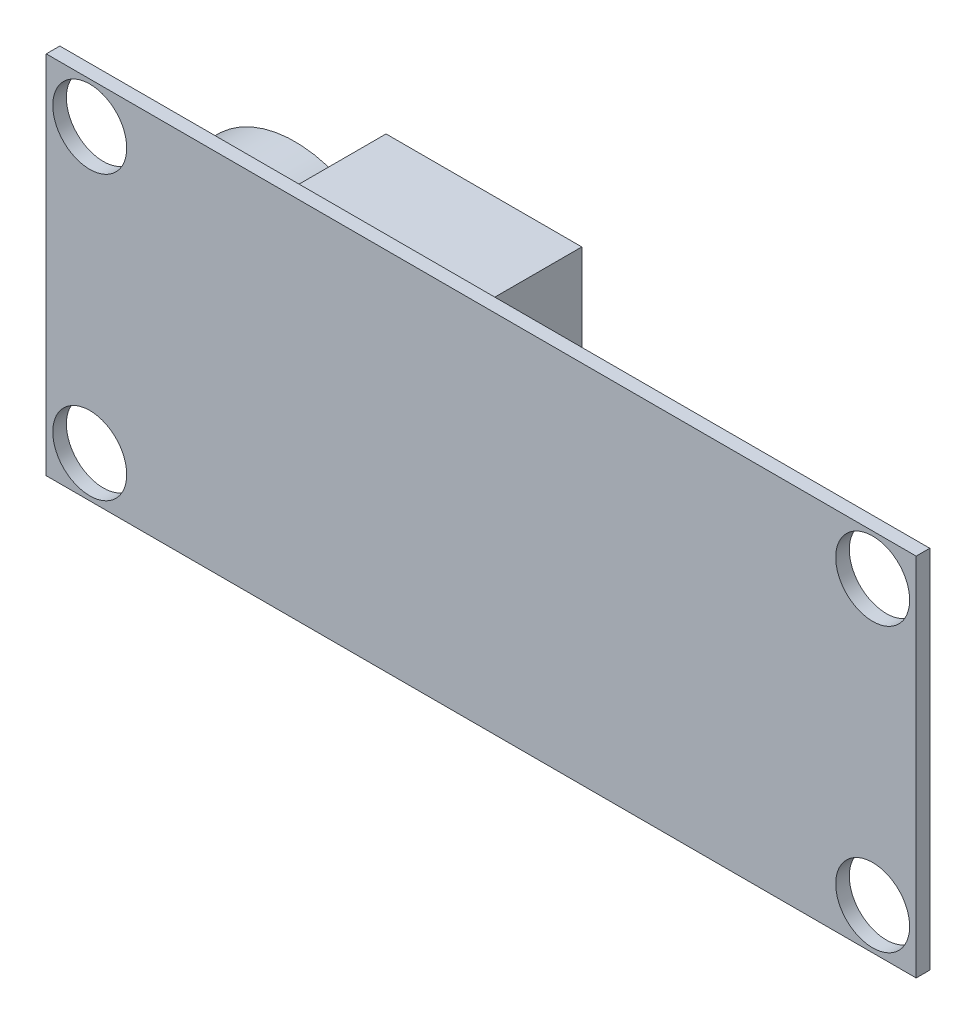
ISO-10303-21;
HEADER;
FILE_DESCRIPTION(('STEP AP214'),'2;1');
FILE_NAME('part.step','',(''),(''),'','','');
FILE_SCHEMA(('AUTOMOTIVE_DESIGN { 1 0 10303 214 1 1 1 1 }'));
ENDSEC;
DATA;
#1=APPLICATION_CONTEXT('core data for automotive mechanical design processes');
#2=APPLICATION_PROTOCOL_DEFINITION('international standard','automotive_design',2000,#1);
#3=PRODUCT_CONTEXT('',#1,'mechanical');
#4=PRODUCT('Part','Part','',(#3));
#5=PRODUCT_RELATED_PRODUCT_CATEGORY('part','',(#4));
#6=PRODUCT_DEFINITION_FORMATION('','',#4);
#7=PRODUCT_DEFINITION_CONTEXT('part definition',#1,'design');
#8=PRODUCT_DEFINITION('design','',#6,#7);
#9=PRODUCT_DEFINITION_SHAPE('','',#8);
#10=(LENGTH_UNIT() NAMED_UNIT(*) SI_UNIT(.MILLI.,.METRE.));
#11=(NAMED_UNIT(*) PLANE_ANGLE_UNIT() SI_UNIT($,.RADIAN.));
#12=(NAMED_UNIT(*) SI_UNIT($,.STERADIAN.) SOLID_ANGLE_UNIT());
#13=UNCERTAINTY_MEASURE_WITH_UNIT(LENGTH_MEASURE(1.E-05),#10,'distance_accuracy_value','');
#14=(GEOMETRIC_REPRESENTATION_CONTEXT(3) GLOBAL_UNCERTAINTY_ASSIGNED_CONTEXT((#13)) GLOBAL_UNIT_ASSIGNED_CONTEXT((#10,
#11,#12)) REPRESENTATION_CONTEXT('',''));
#15=CARTESIAN_POINT('',(0.,0.,0.));
#16=DIRECTION('',(0.,0.,1.));
#17=DIRECTION('',(1.,0.,0.));
#18=AXIS2_PLACEMENT_3D('',#15,#16,#17);
#19=CARTESIAN_POINT('',(13.97,10.668,-3.22710674583158));
#20=DIRECTION('',(1.,0.,0.));
#21=DIRECTION('',(0.,0.,-1.));
#22=AXIS2_PLACEMENT_3D('',#19,#20,#21);
#23=CYLINDRICAL_SURFACE('',#22,3.048);
#24=CARTESIAN_POINT('',(13.97,10.668,-3.22710674583158));
#25=DIRECTION('',(1.,0.,0.));
#26=DIRECTION('',(0.,0.,-1.));
#27=AXIS2_PLACEMENT_3D('',#24,#25,#26);
#28=CIRCLE('',#27,3.048);
#29=CARTESIAN_POINT('',(13.97,10.668,-6.27510674583158));
#30=VERTEX_POINT('',#29);
#31=EDGE_CURVE('E11',#30,#30,#28,.T.);
#32=ORIENTED_EDGE('',*,*,#31,.T.);
#33=EDGE_LOOP('',(#32));
#34=FACE_BOUND('',#33,.T.);
#35=CARTESIAN_POINT('',(24.13,10.668,-3.22710674583158));
#36=DIRECTION('',(1.,0.,0.));
#37=DIRECTION('',(0.,0.,-1.));
#38=AXIS2_PLACEMENT_3D('',#35,#36,#37);
#39=CIRCLE('',#38,3.048);
#40=CARTESIAN_POINT('',(24.13,10.668,-6.27510674583158));
#41=VERTEX_POINT('',#40);
#42=EDGE_CURVE('E48',#41,#41,#39,.T.);
#43=ORIENTED_EDGE('',*,*,#42,.F.);
#44=EDGE_LOOP('',(#43));
#45=FACE_BOUND('',#44,.T.);
#46=ADVANCED_FACE('F45',(#34,#45),#23,.T.);
#47=CARTESIAN_POINT('',(13.97,10.668,-3.22710674583158));
#48=DIRECTION('',(1.,0.,0.));
#49=DIRECTION('',(0.,0.,-1.));
#50=AXIS2_PLACEMENT_3D('',#47,#48,#49);
#51=PLANE('',#50);
#52=ORIENTED_EDGE('',*,*,#31,.F.);
#53=EDGE_LOOP('',(#52));
#54=FACE_BOUND('',#53,.T.);
#55=ADVANCED_FACE('F60',(#54),#51,.F.);
#56=CARTESIAN_POINT('',(24.13,10.668,-3.22710674583158));
#57=DIRECTION('',(1.,0.,0.));
#58=DIRECTION('',(0.,0.,-1.));
#59=AXIS2_PLACEMENT_3D('',#56,#57,#58);
#60=PLANE('',#59);
#61=ORIENTED_EDGE('',*,*,#42,.T.);
#62=EDGE_LOOP('',(#61));
#63=FACE_BOUND('',#62,.T.);
#64=ADVANCED_FACE('F57',(#63),#60,.T.);
#65=CLOSED_SHELL('',(#46,#55,#64));
#66=MANIFOLD_SOLID_BREP('B2',#65);
#67=CARTESIAN_POINT('',(0.,0.,0.));
#68=DIRECTION('',(0.,0.,-1.));
#69=DIRECTION('',(-1.,0.,0.));
#70=AXIS2_PLACEMENT_3D('',#67,#68,#69);
#71=PLANE('',#70);
#72=CARTESIAN_POINT('',(7.37712000203805,10.668,0.));
#73=DIRECTION('',(0.,0.,-1.));
#74=DIRECTION('',(-1.,0.,0.));
#75=AXIS2_PLACEMENT_3D('',#72,#73,#74);
#76=CIRCLE('',#75,6.35);
#77=CARTESIAN_POINT('',(1.02712000203805,10.668,0.));
#78=VERTEX_POINT('',#77);
#79=EDGE_CURVE('E428',#78,#78,#76,.T.);
#80=ORIENTED_EDGE('',*,*,#79,.F.);
#81=EDGE_LOOP('',(#80));
#82=FACE_BOUND('',#81,.T.);
#83=CARTESIAN_POINT('',(48.26,18.923,0.));
#84=DIRECTION('',(0.,0.,1.));
#85=DIRECTION('',(1.,0.,0.));
#86=AXIS2_PLACEMENT_3D('',#83,#84,#85);
#87=CIRCLE('',#86,2.159);
#88=CARTESIAN_POINT('',(50.419,18.923,0.));
#89=VERTEX_POINT('',#88);
#90=EDGE_CURVE('E252',#89,#89,#87,.T.);
#91=ORIENTED_EDGE('',*,*,#90,.T.);
#92=EDGE_LOOP('',(#91));
#93=FACE_BOUND('',#92,.T.);
#94=CARTESIAN_POINT('',(48.26,2.413,0.));
#95=DIRECTION('',(0.,0.,1.));
#96=DIRECTION('',(1.,0.,0.));
#97=AXIS2_PLACEMENT_3D('',#94,#95,#96);
#98=CIRCLE('',#97,2.159);
#99=CARTESIAN_POINT('',(50.419,2.413,0.));
#100=VERTEX_POINT('',#99);
#101=EDGE_CURVE('E246',#100,#100,#98,.T.);
#102=ORIENTED_EDGE('',*,*,#101,.T.);
#103=EDGE_LOOP('',(#102));
#104=FACE_BOUND('',#103,.T.);
#105=CARTESIAN_POINT('',(2.54,2.413,0.));
#106=DIRECTION('',(0.,0.,1.));
#107=DIRECTION('',(1.,0.,0.));
#108=AXIS2_PLACEMENT_3D('',#105,#106,#107);
#109=CIRCLE('',#108,2.159);
#110=CARTESIAN_POINT('',(4.699,2.413,0.));
#111=VERTEX_POINT('',#110);
#112=EDGE_CURVE('E239',#111,#111,#109,.T.);
#113=ORIENTED_EDGE('',*,*,#112,.T.);
#114=EDGE_LOOP('',(#113));
#115=FACE_BOUND('',#114,.T.);
#116=CARTESIAN_POINT('',(2.54,18.923,0.));
#117=DIRECTION('',(0.,0.,1.));
#118=DIRECTION('',(1.,0.,0.));
#119=AXIS2_PLACEMENT_3D('',#116,#117,#118);
#120=CIRCLE('',#119,2.159);
#121=CARTESIAN_POINT('',(4.699,18.923,0.));
#122=VERTEX_POINT('',#121);
#123=EDGE_CURVE('E257',#122,#122,#120,.T.);
#124=ORIENTED_EDGE('',*,*,#123,.T.);
#125=EDGE_LOOP('',(#124));
#126=FACE_BOUND('',#125,.T.);
#127=DIRECTION('',(0.,-1.,0.));
#128=VECTOR('',#127,1.);
#129=CARTESIAN_POINT('',(0.,0.,0.));
#130=LINE('',#129,#128);
#131=CARTESIAN_POINT('',(0.,21.336,0.));
#132=VERTEX_POINT('',#131);
#133=CARTESIAN_POINT('',(0.,0.,0.));
#134=VERTEX_POINT('',#133);
#135=EDGE_CURVE('E260',#132,#134,#130,.T.);
#136=ORIENTED_EDGE('',*,*,#135,.F.);
#137=DIRECTION('',(-1.,0.,0.));
#138=VECTOR('',#137,1.);
#139=CARTESIAN_POINT('',(0.,21.336,0.));
#140=LINE('',#139,#138);
#141=CARTESIAN_POINT('',(50.8,21.336,0.));
#142=VERTEX_POINT('',#141);
#143=EDGE_CURVE('E267',#142,#132,#140,.T.);
#144=ORIENTED_EDGE('',*,*,#143,.F.);
#145=DIRECTION('',(0.,1.,0.));
#146=VECTOR('',#145,1.);
#147=CARTESIAN_POINT('',(50.8,0.,0.));
#148=LINE('',#147,#146);
#149=CARTESIAN_POINT('',(50.8,0.,0.));
#150=VERTEX_POINT('',#149);
#151=EDGE_CURVE('E278',#150,#142,#148,.T.);
#152=ORIENTED_EDGE('',*,*,#151,.F.);
#153=DIRECTION('',(1.,0.,0.));
#154=VECTOR('',#153,1.);
#155=CARTESIAN_POINT('',(0.,0.,0.));
#156=LINE('',#155,#154);
#157=EDGE_CURVE('E276',#134,#150,#156,.T.);
#158=ORIENTED_EDGE('',*,*,#157,.F.);
#159=EDGE_LOOP('',(#136,#144,#152,#158));
#160=FACE_BOUND('',#159,.T.);
#161=DIRECTION('',(-1.,0.,0.));
#162=VECTOR('',#161,1.);
#163=CARTESIAN_POINT('',(24.13,14.986,0.));
#164=LINE('',#163,#162);
#165=CARTESIAN_POINT('',(24.13,14.986,0.));
#166=VERTEX_POINT('',#165);
#167=CARTESIAN_POINT('',(12.7,14.986,0.));
#168=VERTEX_POINT('',#167);
#169=EDGE_CURVE('E210',#166,#168,#164,.T.);
#170=ORIENTED_EDGE('',*,*,#169,.F.);
#171=DIRECTION('',(0.,-1.,0.));
#172=VECTOR('',#171,1.);
#173=CARTESIAN_POINT('',(24.13,20.066,0.));
#174=LINE('',#173,#172);
#175=CARTESIAN_POINT('',(24.13,20.066,0.));
#176=VERTEX_POINT('',#175);
#177=EDGE_CURVE('E207',#176,#166,#174,.T.);
#178=ORIENTED_EDGE('',*,*,#177,.F.);
#179=DIRECTION('',(1.,0.,0.));
#180=VECTOR('',#179,1.);
#181=CARTESIAN_POINT('',(24.13,20.066,0.));
#182=LINE('',#181,#180);
#183=CARTESIAN_POINT('',(12.7,20.066,0.));
#184=VERTEX_POINT('',#183);
#185=EDGE_CURVE('E219',#184,#176,#182,.T.);
#186=ORIENTED_EDGE('',*,*,#185,.F.);
#187=DIRECTION('',(0.,1.,0.));
#188=VECTOR('',#187,1.);
#189=CARTESIAN_POINT('',(12.7,20.066,0.));
#190=LINE('',#189,#188);
#191=EDGE_CURVE('E227',#168,#184,#190,.T.);
#192=ORIENTED_EDGE('',*,*,#191,.F.);
#193=EDGE_LOOP('',(#170,#178,#186,#192));
#194=FACE_BOUND('',#193,.T.);
#195=DIRECTION('',(-1.,0.,0.));
#196=VECTOR('',#195,1.);
#197=CARTESIAN_POINT('',(24.13,1.27,0.));
#198=LINE('',#197,#196);
#199=CARTESIAN_POINT('',(24.13,1.27,0.));
#200=VERTEX_POINT('',#199);
#201=CARTESIAN_POINT('',(12.7,1.27,0.));
#202=VERTEX_POINT('',#201);
#203=EDGE_CURVE('E430',#200,#202,#198,.T.);
#204=ORIENTED_EDGE('',*,*,#203,.F.);
#205=DIRECTION('',(0.,-1.,0.));
#206=VECTOR('',#205,1.);
#207=CARTESIAN_POINT('',(24.13,6.35,0.));
#208=LINE('',#207,#206);
#209=CARTESIAN_POINT('',(24.13,6.35,0.));
#210=VERTEX_POINT('',#209);
#211=EDGE_CURVE('E205',#210,#200,#208,.T.);
#212=ORIENTED_EDGE('',*,*,#211,.F.);
#213=DIRECTION('',(1.,0.,0.));
#214=VECTOR('',#213,1.);
#215=CARTESIAN_POINT('',(24.13,6.35,0.));
#216=LINE('',#215,#214);
#217=CARTESIAN_POINT('',(12.7,6.35,0.));
#218=VERTEX_POINT('',#217);
#219=EDGE_CURVE('E201',#218,#210,#216,.T.);
#220=ORIENTED_EDGE('',*,*,#219,.F.);
#221=DIRECTION('',(0.,1.,0.));
#222=VECTOR('',#221,1.);
#223=CARTESIAN_POINT('',(12.7,6.35,0.));
#224=LINE('',#223,#222);
#225=EDGE_CURVE('E439',#202,#218,#224,.T.);
#226=ORIENTED_EDGE('',*,*,#225,.F.);
#227=EDGE_LOOP('',(#204,#212,#220,#226));
#228=FACE_BOUND('',#227,.T.);
#229=ADVANCED_FACE('F92',(#82,#93,#104,#115,#126,#160,#194,#228),#71,.T.);
#230=CARTESIAN_POINT('',(0.,0.,0.79375));
#231=DIRECTION('',(1.,0.,0.));
#232=DIRECTION('',(0.,0.,-1.));
#233=AXIS2_PLACEMENT_3D('',#230,#231,#232);
#234=PLANE('',#233);
#235=ORIENTED_EDGE('',*,*,#135,.T.);
#236=DIRECTION('',(0.,0.,-1.));
#237=VECTOR('',#236,1.);
#238=CARTESIAN_POINT('',(0.,0.,0.79375));
#239=LINE('',#238,#237);
#240=CARTESIAN_POINT('',(0.,0.,0.79375));
#241=VERTEX_POINT('',#240);
#242=EDGE_CURVE('E43',#241,#134,#239,.T.);
#243=ORIENTED_EDGE('',*,*,#242,.F.);
#244=DIRECTION('',(0.,-1.,0.));
#245=VECTOR('',#244,1.);
#246=CARTESIAN_POINT('',(0.,0.,0.79375));
#247=LINE('',#246,#245);
#248=CARTESIAN_POINT('',(0.,21.336,0.79375));
#249=VERTEX_POINT('',#248);
#250=EDGE_CURVE('E263',#249,#241,#247,.T.);
#251=ORIENTED_EDGE('',*,*,#250,.F.);
#252=DIRECTION('',(0.,0.,-1.));
#253=VECTOR('',#252,1.);
#254=CARTESIAN_POINT('',(0.,21.336,0.79375));
#255=LINE('',#254,#253);
#256=EDGE_CURVE('E273',#249,#132,#255,.T.);
#257=ORIENTED_EDGE('',*,*,#256,.T.);
#258=EDGE_LOOP('',(#235,#243,#251,#257));
#259=FACE_BOUND('',#258,.T.);
#260=ADVANCED_FACE('F94',(#259),#234,.F.);
#261=CARTESIAN_POINT('',(0.,0.,0.79375));
#262=DIRECTION('',(0.,1.,0.));
#263=DIRECTION('',(0.,0.,1.));
#264=AXIS2_PLACEMENT_3D('',#261,#262,#263);
#265=PLANE('',#264);
#266=ORIENTED_EDGE('',*,*,#157,.T.);
#267=DIRECTION('',(0.,0.,-1.));
#268=VECTOR('',#267,1.);
#269=CARTESIAN_POINT('',(50.8,0.,0.79375));
#270=LINE('',#269,#268);
#271=CARTESIAN_POINT('',(50.8,0.,0.79375));
#272=VERTEX_POINT('',#271);
#273=EDGE_CURVE('E100',#272,#150,#270,.T.);
#274=ORIENTED_EDGE('',*,*,#273,.F.);
#275=DIRECTION('',(1.,0.,0.));
#276=VECTOR('',#275,1.);
#277=CARTESIAN_POINT('',(0.,0.,0.79375));
#278=LINE('',#277,#276);
#279=EDGE_CURVE('E266',#241,#272,#278,.T.);
#280=ORIENTED_EDGE('',*,*,#279,.F.);
#281=ORIENTED_EDGE('',*,*,#242,.T.);
#282=EDGE_LOOP('',(#266,#274,#280,#281));
#283=FACE_BOUND('',#282,.T.);
#284=ADVANCED_FACE('F306',(#283),#265,.F.);
#285=CARTESIAN_POINT('',(50.8,0.,0.79375));
#286=DIRECTION('',(-1.,0.,0.));
#287=DIRECTION('',(0.,0.,1.));
#288=AXIS2_PLACEMENT_3D('',#285,#286,#287);
#289=PLANE('',#288);
#290=ORIENTED_EDGE('',*,*,#151,.T.);
#291=DIRECTION('',(0.,0.,-1.));
#292=VECTOR('',#291,1.);
#293=CARTESIAN_POINT('',(50.8,21.336,0.79375));
#294=LINE('',#293,#292);
#295=CARTESIAN_POINT('',(50.8,21.336,0.79375));
#296=VERTEX_POINT('',#295);
#297=EDGE_CURVE('E283',#296,#142,#294,.T.);
#298=ORIENTED_EDGE('',*,*,#297,.F.);
#299=DIRECTION('',(0.,1.,0.));
#300=VECTOR('',#299,1.);
#301=CARTESIAN_POINT('',(50.8,0.,0.79375));
#302=LINE('',#301,#300);
#303=EDGE_CURVE('E269',#272,#296,#302,.T.);
#304=ORIENTED_EDGE('',*,*,#303,.F.);
#305=ORIENTED_EDGE('',*,*,#273,.T.);
#306=EDGE_LOOP('',(#290,#298,#304,#305));
#307=FACE_BOUND('',#306,.T.);
#308=ADVANCED_FACE('F290',(#307),#289,.F.);
#309=CARTESIAN_POINT('',(0.,21.336,0.79375));
#310=DIRECTION('',(0.,-1.,0.));
#311=DIRECTION('',(0.,0.,-1.));
#312=AXIS2_PLACEMENT_3D('',#309,#310,#311);
#313=PLANE('',#312);
#314=ORIENTED_EDGE('',*,*,#143,.T.);
#315=ORIENTED_EDGE('',*,*,#256,.F.);
#316=DIRECTION('',(-1.,0.,0.));
#317=VECTOR('',#316,1.);
#318=CARTESIAN_POINT('',(0.,21.336,0.79375));
#319=LINE('',#318,#317);
#320=EDGE_CURVE('E271',#296,#249,#319,.T.);
#321=ORIENTED_EDGE('',*,*,#320,.F.);
#322=ORIENTED_EDGE('',*,*,#297,.T.);
#323=EDGE_LOOP('',(#314,#315,#321,#322));
#324=FACE_BOUND('',#323,.T.);
#325=ADVANCED_FACE('F299',(#324),#313,.F.);
#326=CARTESIAN_POINT('',(0.,0.,0.79375));
#327=DIRECTION('',(0.,0.,-1.));
#328=DIRECTION('',(-1.,0.,0.));
#329=AXIS2_PLACEMENT_3D('',#326,#327,#328);
#330=PLANE('',#329);
#331=CARTESIAN_POINT('',(48.26,18.923,0.79375));
#332=DIRECTION('',(0.,0.,1.));
#333=DIRECTION('',(1.,0.,0.));
#334=AXIS2_PLACEMENT_3D('',#331,#332,#333);
#335=CIRCLE('',#334,2.159);
#336=CARTESIAN_POINT('',(50.419,18.923,0.79375));
#337=VERTEX_POINT('',#336);
#338=EDGE_CURVE('E238',#337,#337,#335,.T.);
#339=ORIENTED_EDGE('',*,*,#338,.F.);
#340=EDGE_LOOP('',(#339));
#341=FACE_BOUND('',#340,.T.);
#342=CARTESIAN_POINT('',(48.26,2.413,0.79375));
#343=DIRECTION('',(0.,0.,1.));
#344=DIRECTION('',(1.,0.,0.));
#345=AXIS2_PLACEMENT_3D('',#342,#343,#344);
#346=CIRCLE('',#345,2.159);
#347=CARTESIAN_POINT('',(50.419,2.413,0.79375));
#348=VERTEX_POINT('',#347);
#349=EDGE_CURVE('E249',#348,#348,#346,.T.);
#350=ORIENTED_EDGE('',*,*,#349,.F.);
#351=EDGE_LOOP('',(#350));
#352=FACE_BOUND('',#351,.T.);
#353=CARTESIAN_POINT('',(2.54,2.413,0.79375));
#354=DIRECTION('',(0.,0.,1.));
#355=DIRECTION('',(1.,0.,0.));
#356=AXIS2_PLACEMENT_3D('',#353,#354,#355);
#357=CIRCLE('',#356,2.159);
#358=CARTESIAN_POINT('',(4.699,2.413,0.79375));
#359=VERTEX_POINT('',#358);
#360=EDGE_CURVE('E243',#359,#359,#357,.T.);
#361=ORIENTED_EDGE('',*,*,#360,.F.);
#362=EDGE_LOOP('',(#361));
#363=FACE_BOUND('',#362,.T.);
#364=CARTESIAN_POINT('',(2.54,18.923,0.79375));
#365=DIRECTION('',(0.,0.,1.));
#366=DIRECTION('',(1.,0.,0.));
#367=AXIS2_PLACEMENT_3D('',#364,#365,#366);
#368=CIRCLE('',#367,2.159);
#369=CARTESIAN_POINT('',(4.699,18.923,0.79375));
#370=VERTEX_POINT('',#369);
#371=EDGE_CURVE('E242',#370,#370,#368,.T.);
#372=ORIENTED_EDGE('',*,*,#371,.F.);
#373=EDGE_LOOP('',(#372));
#374=FACE_BOUND('',#373,.T.);
#375=ORIENTED_EDGE('',*,*,#250,.T.);
#376=ORIENTED_EDGE('',*,*,#279,.T.);
#377=ORIENTED_EDGE('',*,*,#303,.T.);
#378=ORIENTED_EDGE('',*,*,#320,.T.);
#379=EDGE_LOOP('',(#375,#376,#377,#378));
#380=FACE_BOUND('',#379,.T.);
#381=ADVANCED_FACE('F305',(#341,#352,#363,#374,#380),#330,.F.);
#382=CARTESIAN_POINT('',(2.54,18.923,0.));
#383=DIRECTION('',(0.,0.,1.));
#384=DIRECTION('',(1.,0.,0.));
#385=AXIS2_PLACEMENT_3D('',#382,#383,#384);
#386=CYLINDRICAL_SURFACE('',#385,2.159);
#387=ORIENTED_EDGE('',*,*,#123,.F.);
#388=EDGE_LOOP('',(#387));
#389=FACE_BOUND('',#388,.T.);
#390=ORIENTED_EDGE('',*,*,#371,.T.);
#391=EDGE_LOOP('',(#390));
#392=FACE_BOUND('',#391,.T.);
#393=ADVANCED_FACE('F328',(#389,#392),#386,.F.);
#394=CARTESIAN_POINT('',(2.54,2.413,0.));
#395=DIRECTION('',(0.,0.,1.));
#396=DIRECTION('',(1.,0.,0.));
#397=AXIS2_PLACEMENT_3D('',#394,#395,#396);
#398=CYLINDRICAL_SURFACE('',#397,2.159);
#399=ORIENTED_EDGE('',*,*,#112,.F.);
#400=EDGE_LOOP('',(#399));
#401=FACE_BOUND('',#400,.T.);
#402=ORIENTED_EDGE('',*,*,#360,.T.);
#403=EDGE_LOOP('',(#402));
#404=FACE_BOUND('',#403,.T.);
#405=ADVANCED_FACE('F333',(#401,#404),#398,.F.);
#406=CARTESIAN_POINT('',(48.26,2.413,0.));
#407=DIRECTION('',(0.,0.,1.));
#408=DIRECTION('',(1.,0.,0.));
#409=AXIS2_PLACEMENT_3D('',#406,#407,#408);
#410=CYLINDRICAL_SURFACE('',#409,2.159);
#411=ORIENTED_EDGE('',*,*,#101,.F.);
#412=EDGE_LOOP('',(#411));
#413=FACE_BOUND('',#412,.T.);
#414=ORIENTED_EDGE('',*,*,#349,.T.);
#415=EDGE_LOOP('',(#414));
#416=FACE_BOUND('',#415,.T.);
#417=ADVANCED_FACE('F345',(#413,#416),#410,.F.);
#418=CARTESIAN_POINT('',(48.26,18.923,0.));
#419=DIRECTION('',(0.,0.,1.));
#420=DIRECTION('',(1.,0.,0.));
#421=AXIS2_PLACEMENT_3D('',#418,#419,#420);
#422=CYLINDRICAL_SURFACE('',#421,2.159);
#423=ORIENTED_EDGE('',*,*,#90,.F.);
#424=EDGE_LOOP('',(#423));
#425=FACE_BOUND('',#424,.T.);
#426=ORIENTED_EDGE('',*,*,#338,.T.);
#427=EDGE_LOOP('',(#426));
#428=FACE_BOUND('',#427,.T.);
#429=ADVANCED_FACE('F351',(#425,#428),#422,.F.);
#430=CARTESIAN_POINT('',(24.13,20.066,-6.35));
#431=DIRECTION('',(-1.,0.,0.));
#432=DIRECTION('',(0.,0.,1.));
#433=AXIS2_PLACEMENT_3D('',#430,#431,#432);
#434=PLANE('',#433);
#435=ORIENTED_EDGE('',*,*,#177,.T.);
#436=DIRECTION('',(0.,0.,1.));
#437=VECTOR('',#436,1.);
#438=CARTESIAN_POINT('',(24.13,14.986,-6.35));
#439=LINE('',#438,#437);
#440=CARTESIAN_POINT('',(24.13,14.986,-6.35));
#441=VERTEX_POINT('',#440);
#442=EDGE_CURVE('E236',#441,#166,#439,.T.);
#443=ORIENTED_EDGE('',*,*,#442,.F.);
#444=DIRECTION('',(0.,-1.,0.));
#445=VECTOR('',#444,1.);
#446=CARTESIAN_POINT('',(24.13,20.066,-6.35));
#447=LINE('',#446,#445);
#448=CARTESIAN_POINT('',(24.13,20.066,-6.35));
#449=VERTEX_POINT('',#448);
#450=EDGE_CURVE('E215',#449,#441,#447,.T.);
#451=ORIENTED_EDGE('',*,*,#450,.F.);
#452=DIRECTION('',(0.,0.,1.));
#453=VECTOR('',#452,1.);
#454=CARTESIAN_POINT('',(24.13,20.066,-6.35));
#455=LINE('',#454,#453);
#456=EDGE_CURVE('E224',#449,#176,#455,.T.);
#457=ORIENTED_EDGE('',*,*,#456,.T.);
#458=EDGE_LOOP('',(#435,#443,#451,#457));
#459=FACE_BOUND('',#458,.T.);
#460=ADVANCED_FACE('F356',(#459),#434,.F.);
#461=CARTESIAN_POINT('',(24.13,14.986,-6.35));
#462=DIRECTION('',(0.,1.,0.));
#463=DIRECTION('',(-1.,0.,0.));
#464=AXIS2_PLACEMENT_3D('',#461,#462,#463);
#465=PLANE('',#464);
#466=ORIENTED_EDGE('',*,*,#169,.T.);
#467=DIRECTION('',(0.,0.,1.));
#468=VECTOR('',#467,1.);
#469=CARTESIAN_POINT('',(12.7,14.986,-6.35));
#470=LINE('',#469,#468);
#471=CARTESIAN_POINT('',(12.7,14.986,-6.35));
#472=VERTEX_POINT('',#471);
#473=EDGE_CURVE('E233',#472,#168,#470,.T.);
#474=ORIENTED_EDGE('',*,*,#473,.F.);
#475=DIRECTION('',(-1.,0.,0.));
#476=VECTOR('',#475,1.);
#477=CARTESIAN_POINT('',(24.13,14.986,-6.35));
#478=LINE('',#477,#476);
#479=EDGE_CURVE('E218',#441,#472,#478,.T.);
#480=ORIENTED_EDGE('',*,*,#479,.F.);
#481=ORIENTED_EDGE('',*,*,#442,.T.);
#482=EDGE_LOOP('',(#466,#474,#480,#481));
#483=FACE_BOUND('',#482,.T.);
#484=ADVANCED_FACE('F365',(#483),#465,.F.);
#485=CARTESIAN_POINT('',(12.7,20.066,-6.35));
#486=DIRECTION('',(1.,0.,0.));
#487=DIRECTION('',(0.,0.,-1.));
#488=AXIS2_PLACEMENT_3D('',#485,#486,#487);
#489=PLANE('',#488);
#490=ORIENTED_EDGE('',*,*,#191,.T.);
#491=DIRECTION('',(0.,0.,1.));
#492=VECTOR('',#491,1.);
#493=CARTESIAN_POINT('',(12.7,20.066,-6.35));
#494=LINE('',#493,#492);
#495=CARTESIAN_POINT('',(12.7,20.066,-6.35));
#496=VERTEX_POINT('',#495);
#497=EDGE_CURVE('E115',#496,#184,#494,.T.);
#498=ORIENTED_EDGE('',*,*,#497,.F.);
#499=DIRECTION('',(0.,1.,0.));
#500=VECTOR('',#499,1.);
#501=CARTESIAN_POINT('',(12.7,20.066,-6.35));
#502=LINE('',#501,#500);
#503=EDGE_CURVE('E221',#472,#496,#502,.T.);
#504=ORIENTED_EDGE('',*,*,#503,.F.);
#505=ORIENTED_EDGE('',*,*,#473,.T.);
#506=EDGE_LOOP('',(#490,#498,#504,#505));
#507=FACE_BOUND('',#506,.T.);
#508=ADVANCED_FACE('F378',(#507),#489,.F.);
#509=CARTESIAN_POINT('',(24.13,20.066,-6.35));
#510=DIRECTION('',(0.,-1.,0.));
#511=DIRECTION('',(0.,0.,-1.));
#512=AXIS2_PLACEMENT_3D('',#509,#510,#511);
#513=PLANE('',#512);
#514=ORIENTED_EDGE('',*,*,#185,.T.);
#515=ORIENTED_EDGE('',*,*,#456,.F.);
#516=DIRECTION('',(1.,0.,0.));
#517=VECTOR('',#516,1.);
#518=CARTESIAN_POINT('',(24.13,20.066,-6.35));
#519=LINE('',#518,#517);
#520=EDGE_CURVE('E223',#496,#449,#519,.T.);
#521=ORIENTED_EDGE('',*,*,#520,.F.);
#522=ORIENTED_EDGE('',*,*,#497,.T.);
#523=EDGE_LOOP('',(#514,#515,#521,#522));
#524=FACE_BOUND('',#523,.T.);
#525=ADVANCED_FACE('F393',(#524),#513,.F.);
#526=CARTESIAN_POINT('',(0.,0.,-6.35));
#527=DIRECTION('',(0.,0.,-1.));
#528=DIRECTION('',(-1.,0.,0.));
#529=AXIS2_PLACEMENT_3D('',#526,#527,#528);
#530=PLANE('',#529);
#531=ORIENTED_EDGE('',*,*,#450,.T.);
#532=ORIENTED_EDGE('',*,*,#479,.T.);
#533=ORIENTED_EDGE('',*,*,#503,.T.);
#534=ORIENTED_EDGE('',*,*,#520,.T.);
#535=EDGE_LOOP('',(#531,#532,#533,#534));
#536=FACE_BOUND('',#535,.T.);
#537=ADVANCED_FACE('F392',(#536),#530,.T.);
#538=CARTESIAN_POINT('',(24.13,6.35,-6.35));
#539=DIRECTION('',(-1.,0.,0.));
#540=DIRECTION('',(0.,0.,1.));
#541=AXIS2_PLACEMENT_3D('',#538,#539,#540);
#542=PLANE('',#541);
#543=ORIENTED_EDGE('',*,*,#211,.T.);
#544=DIRECTION('',(0.,0.,1.));
#545=VECTOR('',#544,1.);
#546=CARTESIAN_POINT('',(24.13,1.27,-6.35));
#547=LINE('',#546,#545);
#548=CARTESIAN_POINT('',(24.13,1.27,-6.35));
#549=VERTEX_POINT('',#548);
#550=EDGE_CURVE('E186',#549,#200,#547,.T.);
#551=ORIENTED_EDGE('',*,*,#550,.F.);
#552=DIRECTION('',(0.,-1.,0.));
#553=VECTOR('',#552,1.);
#554=CARTESIAN_POINT('',(24.13,6.35,-6.35));
#555=LINE('',#554,#553);
#556=CARTESIAN_POINT('',(24.13,6.35,-6.35));
#557=VERTEX_POINT('',#556);
#558=EDGE_CURVE('E193',#557,#549,#555,.T.);
#559=ORIENTED_EDGE('',*,*,#558,.F.);
#560=DIRECTION('',(0.,0.,1.));
#561=VECTOR('',#560,1.);
#562=CARTESIAN_POINT('',(24.13,6.35,-6.35));
#563=LINE('',#562,#561);
#564=EDGE_CURVE('E436',#557,#210,#563,.T.);
#565=ORIENTED_EDGE('',*,*,#564,.T.);
#566=EDGE_LOOP('',(#543,#551,#559,#565));
#567=FACE_BOUND('',#566,.T.);
#568=ADVANCED_FACE('F203',(#567),#542,.F.);
#569=CARTESIAN_POINT('',(24.13,1.27,-6.35));
#570=DIRECTION('',(0.,1.,0.));
#571=DIRECTION('',(-1.,0.,0.));
#572=AXIS2_PLACEMENT_3D('',#569,#570,#571);
#573=PLANE('',#572);
#574=ORIENTED_EDGE('',*,*,#203,.T.);
#575=DIRECTION('',(0.,0.,1.));
#576=VECTOR('',#575,1.);
#577=CARTESIAN_POINT('',(12.7,1.27,-6.35));
#578=LINE('',#577,#576);
#579=CARTESIAN_POINT('',(12.7,1.27,-6.35));
#580=VERTEX_POINT('',#579);
#581=EDGE_CURVE('E189',#580,#202,#578,.T.);
#582=ORIENTED_EDGE('',*,*,#581,.F.);
#583=DIRECTION('',(-1.,0.,0.));
#584=VECTOR('',#583,1.);
#585=CARTESIAN_POINT('',(24.13,1.27,-6.35));
#586=LINE('',#585,#584);
#587=EDGE_CURVE('E182',#549,#580,#586,.T.);
#588=ORIENTED_EDGE('',*,*,#587,.F.);
#589=ORIENTED_EDGE('',*,*,#550,.T.);
#590=EDGE_LOOP('',(#574,#582,#588,#589));
#591=FACE_BOUND('',#590,.T.);
#592=ADVANCED_FACE('F184',(#591),#573,.F.);
#593=CARTESIAN_POINT('',(12.7,6.35,-6.35));
#594=DIRECTION('',(1.,0.,0.));
#595=DIRECTION('',(0.,0.,-1.));
#596=AXIS2_PLACEMENT_3D('',#593,#594,#595);
#597=PLANE('',#596);
#598=ORIENTED_EDGE('',*,*,#225,.T.);
#599=DIRECTION('',(0.,0.,1.));
#600=VECTOR('',#599,1.);
#601=CARTESIAN_POINT('',(12.7,6.35,-6.35));
#602=LINE('',#601,#600);
#603=CARTESIAN_POINT('',(12.7,6.35,-6.35));
#604=VERTEX_POINT('',#603);
#605=EDGE_CURVE('E107',#604,#218,#602,.T.);
#606=ORIENTED_EDGE('',*,*,#605,.F.);
#607=DIRECTION('',(0.,1.,0.));
#608=VECTOR('',#607,1.);
#609=CARTESIAN_POINT('',(12.7,6.35,-6.35));
#610=LINE('',#609,#608);
#611=EDGE_CURVE('E192',#580,#604,#610,.T.);
#612=ORIENTED_EDGE('',*,*,#611,.F.);
#613=ORIENTED_EDGE('',*,*,#581,.T.);
#614=EDGE_LOOP('',(#598,#606,#612,#613));
#615=FACE_BOUND('',#614,.T.);
#616=ADVANCED_FACE('F407',(#615),#597,.F.);
#617=CARTESIAN_POINT('',(24.13,6.35,-6.35));
#618=DIRECTION('',(0.,-1.,0.));
#619=DIRECTION('',(0.,0.,-1.));
#620=AXIS2_PLACEMENT_3D('',#617,#618,#619);
#621=PLANE('',#620);
#622=ORIENTED_EDGE('',*,*,#219,.T.);
#623=ORIENTED_EDGE('',*,*,#564,.F.);
#624=DIRECTION('',(1.,0.,0.));
#625=VECTOR('',#624,1.);
#626=CARTESIAN_POINT('',(24.13,6.35,-6.35));
#627=LINE('',#626,#625);
#628=EDGE_CURVE('E197',#604,#557,#627,.T.);
#629=ORIENTED_EDGE('',*,*,#628,.F.);
#630=ORIENTED_EDGE('',*,*,#605,.T.);
#631=EDGE_LOOP('',(#622,#623,#629,#630));
#632=FACE_BOUND('',#631,.T.);
#633=ADVANCED_FACE('F410',(#632),#621,.F.);
#634=CARTESIAN_POINT('',(0.,0.,-6.35));
#635=DIRECTION('',(0.,0.,-1.));
#636=DIRECTION('',(-1.,0.,0.));
#637=AXIS2_PLACEMENT_3D('',#634,#635,#636);
#638=PLANE('',#637);
#639=ORIENTED_EDGE('',*,*,#558,.T.);
#640=ORIENTED_EDGE('',*,*,#587,.T.);
#641=ORIENTED_EDGE('',*,*,#611,.T.);
#642=ORIENTED_EDGE('',*,*,#628,.T.);
#643=EDGE_LOOP('',(#639,#640,#641,#642));
#644=FACE_BOUND('',#643,.T.);
#645=ADVANCED_FACE('F196',(#644),#638,.T.);
#646=CARTESIAN_POINT('',(7.37712000203805,10.668,-6.35));
#647=DIRECTION('',(0.,0.,1.));
#648=DIRECTION('',(1.,0.,0.));
#649=AXIS2_PLACEMENT_3D('',#646,#647,#648);
#650=CYLINDRICAL_SURFACE('',#649,6.35);
#651=CARTESIAN_POINT('',(7.37712000203805,10.668,-6.35));
#652=DIRECTION('',(0.,0.,-1.));
#653=DIRECTION('',(-1.,0.,0.));
#654=AXIS2_PLACEMENT_3D('',#651,#652,#653);
#655=CIRCLE('',#654,6.35);
#656=CARTESIAN_POINT('',(1.02712000203805,10.668,-6.35));
#657=VERTEX_POINT('',#656);
#658=EDGE_CURVE('E427',#657,#657,#655,.T.);
#659=ORIENTED_EDGE('',*,*,#658,.F.);
#660=EDGE_LOOP('',(#659));
#661=FACE_BOUND('',#660,.T.);
#662=ORIENTED_EDGE('',*,*,#79,.T.);
#663=EDGE_LOOP('',(#662));
#664=FACE_BOUND('',#663,.T.);
#665=ADVANCED_FACE('F416',(#661,#664),#650,.T.);
#666=CARTESIAN_POINT('',(7.37712000203805,10.668,-6.35));
#667=DIRECTION('',(0.,0.,-1.));
#668=DIRECTION('',(-1.,0.,0.));
#669=AXIS2_PLACEMENT_3D('',#666,#667,#668);
#670=PLANE('',#669);
#671=ORIENTED_EDGE('',*,*,#658,.T.);
#672=EDGE_LOOP('',(#671));
#673=FACE_BOUND('',#672,.T.);
#674=ADVANCED_FACE('F419',(#673),#670,.T.);
#675=CLOSED_SHELL('',(#229,#260,#284,#308,#325,#381,#393,#405,#417,#429,#460,#484,#508,#525,
#537,#568,#592,#616,#633,#645,#665,#674));
#676=MANIFOLD_SOLID_BREP('B6',#675);
#677=ADVANCED_BREP_SHAPE_REPRESENTATION('',(#18,#66,#676),#14);
#678=SHAPE_DEFINITION_REPRESENTATION(#9,#677);
ENDSEC;
END-ISO-10303-21;
